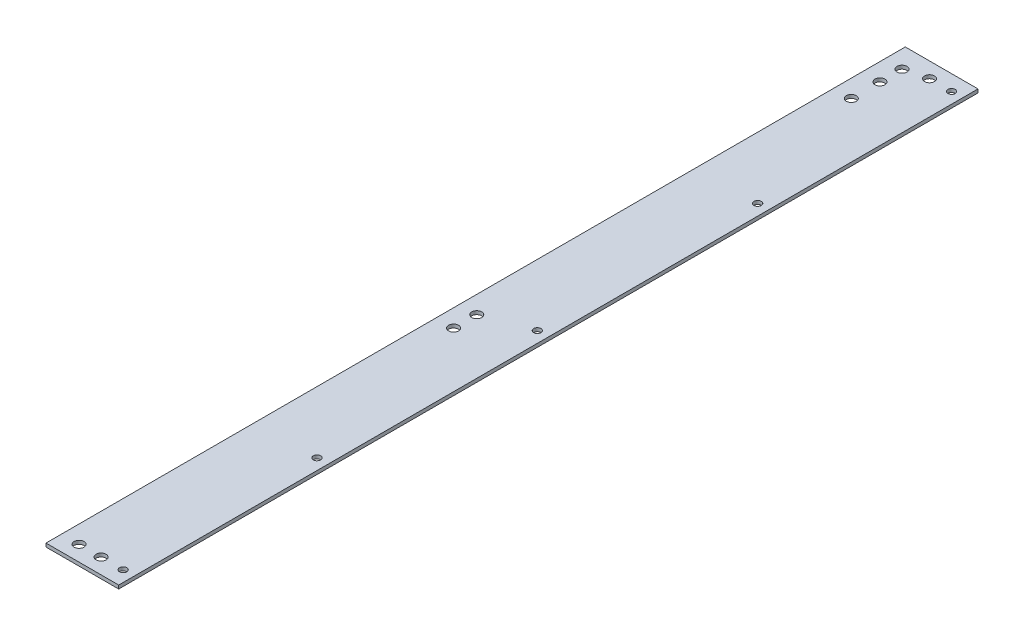
ISO-10303-21;
HEADER;
FILE_DESCRIPTION(('STEP AP214'),'2;1');
FILE_NAME('part.step','',(''),(''),'','','');
FILE_SCHEMA(('AUTOMOTIVE_DESIGN { 1 0 10303 214 1 1 1 1 }'));
ENDSEC;
DATA;
#1=APPLICATION_CONTEXT('core data for automotive mechanical design processes');
#2=APPLICATION_PROTOCOL_DEFINITION('international standard','automotive_design',2000,#1);
#3=PRODUCT_CONTEXT('',#1,'mechanical');
#4=PRODUCT('Part','Part','',(#3));
#5=PRODUCT_RELATED_PRODUCT_CATEGORY('part','',(#4));
#6=PRODUCT_DEFINITION_FORMATION('','',#4);
#7=PRODUCT_DEFINITION_CONTEXT('part definition',#1,'design');
#8=PRODUCT_DEFINITION('design','',#6,#7);
#9=PRODUCT_DEFINITION_SHAPE('','',#8);
#10=(LENGTH_UNIT() NAMED_UNIT(*) SI_UNIT(.MILLI.,.METRE.));
#11=(NAMED_UNIT(*) PLANE_ANGLE_UNIT() SI_UNIT($,.RADIAN.));
#12=(NAMED_UNIT(*) SI_UNIT($,.STERADIAN.) SOLID_ANGLE_UNIT());
#13=UNCERTAINTY_MEASURE_WITH_UNIT(LENGTH_MEASURE(1.E-05),#10,'distance_accuracy_value','');
#14=(GEOMETRIC_REPRESENTATION_CONTEXT(3) GLOBAL_UNCERTAINTY_ASSIGNED_CONTEXT((#13)) GLOBAL_UNIT_ASSIGNED_CONTEXT((#10,
#11,#12)) REPRESENTATION_CONTEXT('',''));
#15=CARTESIAN_POINT('',(0.,0.,0.));
#16=DIRECTION('',(0.,0.,1.));
#17=DIRECTION('',(1.,0.,0.));
#18=AXIS2_PLACEMENT_3D('',#15,#16,#17);
#19=CARTESIAN_POINT('',(0.,1.5875,0.));
#20=DIRECTION('',(0.,-1.,0.));
#21=DIRECTION('',(0.,0.,-1.));
#22=AXIS2_PLACEMENT_3D('',#19,#20,#21);
#23=PLANE('',#22);
#24=CARTESIAN_POINT('',(11.5,1.5875,-188.));
#25=DIRECTION('',(0.,1.,0.));
#26=DIRECTION('',(0.,0.,1.));
#27=AXIS2_PLACEMENT_3D('',#24,#25,#26);
#28=CIRCLE('',#27,1.65);
#29=CARTESIAN_POINT('',(11.5,1.5875,-186.35));
#30=VERTEX_POINT('',#29);
#31=EDGE_CURVE('E195',#30,#30,#28,.T.);
#32=ORIENTED_EDGE('',*,*,#31,.F.);
#33=EDGE_LOOP('',(#32));
#34=FACE_BOUND('',#33,.T.);
#35=CARTESIAN_POINT('',(11.5,1.5875,188.));
#36=DIRECTION('',(0.,1.,0.));
#37=DIRECTION('',(0.,0.,1.));
#38=AXIS2_PLACEMENT_3D('',#35,#36,#37);
#39=CIRCLE('',#38,1.65);
#40=CARTESIAN_POINT('',(11.5,1.5875,189.65));
#41=VERTEX_POINT('',#40);
#42=EDGE_CURVE('E189',#41,#41,#39,.T.);
#43=ORIENTED_EDGE('',*,*,#42,.F.);
#44=EDGE_LOOP('',(#43));
#45=FACE_BOUND('',#44,.T.);
#46=CARTESIAN_POINT('',(11.5,1.5875,-100.));
#47=DIRECTION('',(0.,1.,0.));
#48=DIRECTION('',(0.,0.,1.));
#49=AXIS2_PLACEMENT_3D('',#46,#47,#48);
#50=CIRCLE('',#49,1.65);
#51=CARTESIAN_POINT('',(11.5,1.5875,-98.35));
#52=VERTEX_POINT('',#51);
#53=EDGE_CURVE('E183',#52,#52,#50,.T.);
#54=ORIENTED_EDGE('',*,*,#53,.F.);
#55=EDGE_LOOP('',(#54));
#56=FACE_BOUND('',#55,.T.);
#57=CARTESIAN_POINT('',(11.5,1.5875,100.));
#58=DIRECTION('',(0.,1.,0.));
#59=DIRECTION('',(0.,0.,1.));
#60=AXIS2_PLACEMENT_3D('',#57,#58,#59);
#61=CIRCLE('',#60,1.65);
#62=CARTESIAN_POINT('',(11.5,1.5875,101.65));
#63=VERTEX_POINT('',#62);
#64=EDGE_CURVE('E177',#63,#63,#61,.T.);
#65=ORIENTED_EDGE('',*,*,#64,.F.);
#66=EDGE_LOOP('',(#65));
#67=FACE_BOUND('',#66,.T.);
#68=CARTESIAN_POINT('',(1.50000000000001,1.5875,-188.));
#69=DIRECTION('',(0.,1.,0.));
#70=DIRECTION('',(0.,0.,1.));
#71=AXIS2_PLACEMENT_3D('',#68,#69,#70);
#72=CIRCLE('',#71,2.24999999999999);
#73=CARTESIAN_POINT('',(1.50000000000001,1.5875,-185.75));
#74=VERTEX_POINT('',#73);
#75=EDGE_CURVE('E165',#74,#74,#72,.T.);
#76=ORIENTED_EDGE('',*,*,#75,.F.);
#77=EDGE_LOOP('',(#76));
#78=FACE_BOUND('',#77,.T.);
#79=CARTESIAN_POINT('',(-8.49999999999999,1.5875,-185.5));
#80=DIRECTION('',(0.,1.,0.));
#81=DIRECTION('',(0.,0.,1.));
#82=AXIS2_PLACEMENT_3D('',#79,#80,#81);
#83=CIRCLE('',#82,2.24999999999999);
#84=CARTESIAN_POINT('',(-8.49999999999999,1.5875,-183.25));
#85=VERTEX_POINT('',#84);
#86=EDGE_CURVE('E159',#85,#85,#83,.T.);
#87=ORIENTED_EDGE('',*,*,#86,.F.);
#88=EDGE_LOOP('',(#87));
#89=FACE_BOUND('',#88,.T.);
#90=CARTESIAN_POINT('',(-8.49999999999999,1.5875,-175.5));
#91=DIRECTION('',(0.,1.,0.));
#92=DIRECTION('',(0.,0.,1.));
#93=AXIS2_PLACEMENT_3D('',#90,#91,#92);
#94=CIRCLE('',#93,2.24999999999999);
#95=CARTESIAN_POINT('',(-8.49999999999999,1.5875,-173.25));
#96=VERTEX_POINT('',#95);
#97=EDGE_CURVE('E153',#96,#96,#94,.T.);
#98=ORIENTED_EDGE('',*,*,#97,.F.);
#99=EDGE_LOOP('',(#98));
#100=FACE_BOUND('',#99,.T.);
#101=CARTESIAN_POINT('',(-8.49999999999999,1.5875,-162.5));
#102=DIRECTION('',(0.,1.,0.));
#103=DIRECTION('',(0.,0.,1.));
#104=AXIS2_PLACEMENT_3D('',#101,#102,#103);
#105=CIRCLE('',#104,2.24999999999999);
#106=CARTESIAN_POINT('',(-8.49999999999999,1.5875,-160.25));
#107=VERTEX_POINT('',#106);
#108=EDGE_CURVE('E147',#107,#107,#105,.T.);
#109=ORIENTED_EDGE('',*,*,#108,.F.);
#110=EDGE_LOOP('',(#109));
#111=FACE_BOUND('',#110,.T.);
#112=CARTESIAN_POINT('',(-8.49999999999997,1.5875,18.));
#113=DIRECTION('',(0.,1.,0.));
#114=DIRECTION('',(0.,0.,1.));
#115=AXIS2_PLACEMENT_3D('',#112,#113,#114);
#116=CIRCLE('',#115,2.24999999999999);
#117=CARTESIAN_POINT('',(-8.49999999999997,1.5875,20.25));
#118=VERTEX_POINT('',#117);
#119=EDGE_CURVE('E135',#118,#118,#116,.T.);
#120=ORIENTED_EDGE('',*,*,#119,.F.);
#121=EDGE_LOOP('',(#120));
#122=FACE_BOUND('',#121,.T.);
#123=CARTESIAN_POINT('',(-8.49999999999994,1.5875,188.));
#124=DIRECTION('',(0.,1.,0.));
#125=DIRECTION('',(0.,0.,1.));
#126=AXIS2_PLACEMENT_3D('',#123,#124,#125);
#127=CIRCLE('',#126,2.24999999999999);
#128=CARTESIAN_POINT('',(-8.49999999999994,1.5875,190.25));
#129=VERTEX_POINT('',#128);
#130=EDGE_CURVE('E129',#129,#129,#127,.T.);
#131=ORIENTED_EDGE('',*,*,#130,.F.);
#132=EDGE_LOOP('',(#131));
#133=FACE_BOUND('',#132,.T.);
#134=CARTESIAN_POINT('',(1.50000000000001,1.5875,188.));
#135=DIRECTION('',(0.,1.,0.));
#136=DIRECTION('',(0.,0.,1.));
#137=AXIS2_PLACEMENT_3D('',#134,#135,#136);
#138=CIRCLE('',#137,2.24999999999999);
#139=CARTESIAN_POINT('',(1.50000000000001,1.5875,190.25));
#140=VERTEX_POINT('',#139);
#141=EDGE_CURVE('E123',#140,#140,#138,.T.);
#142=ORIENTED_EDGE('',*,*,#141,.F.);
#143=EDGE_LOOP('',(#142));
#144=FACE_BOUND('',#143,.T.);
#145=DIRECTION('',(0.,0.,-1.));
#146=VECTOR('',#145,1.);
#147=CARTESIAN_POINT('',(16.5,1.5875,195.));
#148=LINE('',#147,#146);
#149=CARTESIAN_POINT('',(16.5,1.5875,195.));
#150=VERTEX_POINT('',#149);
#151=CARTESIAN_POINT('',(16.5,1.5875,-195.));
#152=VERTEX_POINT('',#151);
#153=EDGE_CURVE('E94',#150,#152,#148,.T.);
#154=ORIENTED_EDGE('',*,*,#153,.T.);
#155=DIRECTION('',(-1.,0.,0.));
#156=VECTOR('',#155,1.);
#157=CARTESIAN_POINT('',(-16.5,1.5875,-195.));
#158=LINE('',#157,#156);
#159=CARTESIAN_POINT('',(-16.5,1.5875,-195.));
#160=VERTEX_POINT('',#159);
#161=EDGE_CURVE('E89',#152,#160,#158,.T.);
#162=ORIENTED_EDGE('',*,*,#161,.T.);
#163=DIRECTION('',(0.,0.,1.));
#164=VECTOR('',#163,1.);
#165=CARTESIAN_POINT('',(-16.5,1.5875,195.));
#166=LINE('',#165,#164);
#167=CARTESIAN_POINT('',(-16.5,1.5875,195.));
#168=VERTEX_POINT('',#167);
#169=EDGE_CURVE('E92',#160,#168,#166,.T.);
#170=ORIENTED_EDGE('',*,*,#169,.T.);
#171=DIRECTION('',(1.,0.,0.));
#172=VECTOR('',#171,1.);
#173=CARTESIAN_POINT('',(-16.5,1.5875,195.));
#174=LINE('',#173,#172);
#175=EDGE_CURVE('E59',#168,#150,#174,.T.);
#176=ORIENTED_EDGE('',*,*,#175,.T.);
#177=EDGE_LOOP('',(#154,#162,#170,#176));
#178=FACE_BOUND('',#177,.T.);
#179=CARTESIAN_POINT('',(-8.49999999999997,1.5875,7.49999999999998));
#180=DIRECTION('',(0.,1.,0.));
#181=DIRECTION('',(0.,0.,1.));
#182=AXIS2_PLACEMENT_3D('',#179,#180,#181);
#183=CIRCLE('',#182,2.24999999999999);
#184=CARTESIAN_POINT('',(-8.49999999999997,1.5875,9.74999999999997));
#185=VERTEX_POINT('',#184);
#186=EDGE_CURVE('E141',#185,#185,#183,.T.);
#187=ORIENTED_EDGE('',*,*,#186,.F.);
#188=EDGE_LOOP('',(#187));
#189=FACE_BOUND('',#188,.T.);
#190=CARTESIAN_POINT('',(11.5,1.5875,0.));
#191=DIRECTION('',(0.,1.,0.));
#192=DIRECTION('',(0.,0.,1.));
#193=AXIS2_PLACEMENT_3D('',#190,#191,#192);
#194=CIRCLE('',#193,1.65);
#195=CARTESIAN_POINT('',(11.5,1.5875,1.65));
#196=VERTEX_POINT('',#195);
#197=EDGE_CURVE('E171',#196,#196,#194,.T.);
#198=ORIENTED_EDGE('',*,*,#197,.F.);
#199=EDGE_LOOP('',(#198));
#200=FACE_BOUND('',#199,.T.);
#201=ADVANCED_FACE('F42',(#34,#45,#56,#67,#78,#89,#100,#111,#122,#133,#144,#178,#189,#200),#23,.F.);
#202=CARTESIAN_POINT('',(0.,0.,0.));
#203=DIRECTION('',(0.,-1.,0.));
#204=DIRECTION('',(0.,0.,-1.));
#205=AXIS2_PLACEMENT_3D('',#202,#203,#204);
#206=PLANE('',#205);
#207=CARTESIAN_POINT('',(11.5,0.,-188.));
#208=DIRECTION('',(0.,1.,0.));
#209=DIRECTION('',(0.,0.,1.));
#210=AXIS2_PLACEMENT_3D('',#207,#208,#209);
#211=CIRCLE('',#210,1.65);
#212=CARTESIAN_POINT('',(11.5,0.,-186.35));
#213=VERTEX_POINT('',#212);
#214=EDGE_CURVE('E192',#213,#213,#211,.T.);
#215=ORIENTED_EDGE('',*,*,#214,.T.);
#216=EDGE_LOOP('',(#215));
#217=FACE_BOUND('',#216,.T.);
#218=CARTESIAN_POINT('',(11.5,0.,188.));
#219=DIRECTION('',(0.,1.,0.));
#220=DIRECTION('',(0.,0.,1.));
#221=AXIS2_PLACEMENT_3D('',#218,#219,#220);
#222=CIRCLE('',#221,1.65);
#223=CARTESIAN_POINT('',(11.5,0.,189.65));
#224=VERTEX_POINT('',#223);
#225=EDGE_CURVE('E186',#224,#224,#222,.T.);
#226=ORIENTED_EDGE('',*,*,#225,.T.);
#227=EDGE_LOOP('',(#226));
#228=FACE_BOUND('',#227,.T.);
#229=CARTESIAN_POINT('',(11.5,0.,-100.));
#230=DIRECTION('',(0.,1.,0.));
#231=DIRECTION('',(0.,0.,1.));
#232=AXIS2_PLACEMENT_3D('',#229,#230,#231);
#233=CIRCLE('',#232,1.65);
#234=CARTESIAN_POINT('',(11.5,0.,-98.35));
#235=VERTEX_POINT('',#234);
#236=EDGE_CURVE('E180',#235,#235,#233,.T.);
#237=ORIENTED_EDGE('',*,*,#236,.T.);
#238=EDGE_LOOP('',(#237));
#239=FACE_BOUND('',#238,.T.);
#240=CARTESIAN_POINT('',(11.5,0.,100.));
#241=DIRECTION('',(0.,1.,0.));
#242=DIRECTION('',(0.,0.,1.));
#243=AXIS2_PLACEMENT_3D('',#240,#241,#242);
#244=CIRCLE('',#243,1.65);
#245=CARTESIAN_POINT('',(11.5,0.,101.65));
#246=VERTEX_POINT('',#245);
#247=EDGE_CURVE('E174',#246,#246,#244,.T.);
#248=ORIENTED_EDGE('',*,*,#247,.T.);
#249=EDGE_LOOP('',(#248));
#250=FACE_BOUND('',#249,.T.);
#251=CARTESIAN_POINT('',(11.5,0.,0.));
#252=DIRECTION('',(0.,1.,0.));
#253=DIRECTION('',(0.,0.,1.));
#254=AXIS2_PLACEMENT_3D('',#251,#252,#253);
#255=CIRCLE('',#254,1.65);
#256=CARTESIAN_POINT('',(11.5,0.,1.65));
#257=VERTEX_POINT('',#256);
#258=EDGE_CURVE('E168',#257,#257,#255,.T.);
#259=ORIENTED_EDGE('',*,*,#258,.T.);
#260=EDGE_LOOP('',(#259));
#261=FACE_BOUND('',#260,.T.);
#262=CARTESIAN_POINT('',(1.50000000000001,0.,-188.));
#263=DIRECTION('',(0.,1.,0.));
#264=DIRECTION('',(0.,0.,1.));
#265=AXIS2_PLACEMENT_3D('',#262,#263,#264);
#266=CIRCLE('',#265,2.25);
#267=CARTESIAN_POINT('',(1.50000000000001,0.,-185.75));
#268=VERTEX_POINT('',#267);
#269=EDGE_CURVE('E162',#268,#268,#266,.T.);
#270=ORIENTED_EDGE('',*,*,#269,.T.);
#271=EDGE_LOOP('',(#270));
#272=FACE_BOUND('',#271,.T.);
#273=CARTESIAN_POINT('',(-8.49999999999999,0.,-185.5));
#274=DIRECTION('',(0.,1.,0.));
#275=DIRECTION('',(0.,0.,1.));
#276=AXIS2_PLACEMENT_3D('',#273,#274,#275);
#277=CIRCLE('',#276,2.25);
#278=CARTESIAN_POINT('',(-8.49999999999999,0.,-183.25));
#279=VERTEX_POINT('',#278);
#280=EDGE_CURVE('E156',#279,#279,#277,.T.);
#281=ORIENTED_EDGE('',*,*,#280,.T.);
#282=EDGE_LOOP('',(#281));
#283=FACE_BOUND('',#282,.T.);
#284=CARTESIAN_POINT('',(-8.49999999999999,0.,-175.5));
#285=DIRECTION('',(0.,1.,0.));
#286=DIRECTION('',(0.,0.,1.));
#287=AXIS2_PLACEMENT_3D('',#284,#285,#286);
#288=CIRCLE('',#287,2.25);
#289=CARTESIAN_POINT('',(-8.49999999999999,0.,-173.25));
#290=VERTEX_POINT('',#289);
#291=EDGE_CURVE('E150',#290,#290,#288,.T.);
#292=ORIENTED_EDGE('',*,*,#291,.T.);
#293=EDGE_LOOP('',(#292));
#294=FACE_BOUND('',#293,.T.);
#295=CARTESIAN_POINT('',(-8.49999999999999,0.,-162.5));
#296=DIRECTION('',(0.,1.,0.));
#297=DIRECTION('',(0.,0.,1.));
#298=AXIS2_PLACEMENT_3D('',#295,#296,#297);
#299=CIRCLE('',#298,2.25);
#300=CARTESIAN_POINT('',(-8.49999999999999,0.,-160.25));
#301=VERTEX_POINT('',#300);
#302=EDGE_CURVE('E144',#301,#301,#299,.T.);
#303=ORIENTED_EDGE('',*,*,#302,.T.);
#304=EDGE_LOOP('',(#303));
#305=FACE_BOUND('',#304,.T.);
#306=CARTESIAN_POINT('',(-8.49999999999997,0.,7.49999999999998));
#307=DIRECTION('',(0.,1.,0.));
#308=DIRECTION('',(0.,0.,1.));
#309=AXIS2_PLACEMENT_3D('',#306,#307,#308);
#310=CIRCLE('',#309,2.25);
#311=CARTESIAN_POINT('',(-8.49999999999997,0.,9.74999999999998));
#312=VERTEX_POINT('',#311);
#313=EDGE_CURVE('E138',#312,#312,#310,.T.);
#314=ORIENTED_EDGE('',*,*,#313,.T.);
#315=EDGE_LOOP('',(#314));
#316=FACE_BOUND('',#315,.T.);
#317=DIRECTION('',(0.,0.,-1.));
#318=VECTOR('',#317,1.);
#319=CARTESIAN_POINT('',(16.5,0.,195.));
#320=LINE('',#319,#318);
#321=CARTESIAN_POINT('',(16.5,0.,195.));
#322=VERTEX_POINT('',#321);
#323=CARTESIAN_POINT('',(16.5,0.,-195.));
#324=VERTEX_POINT('',#323);
#325=EDGE_CURVE('E106',#322,#324,#320,.T.);
#326=ORIENTED_EDGE('',*,*,#325,.F.);
#327=DIRECTION('',(1.,0.,0.));
#328=VECTOR('',#327,1.);
#329=CARTESIAN_POINT('',(-16.5,0.,195.));
#330=LINE('',#329,#328);
#331=CARTESIAN_POINT('',(-16.5,0.,195.));
#332=VERTEX_POINT('',#331);
#333=EDGE_CURVE('E82',#332,#322,#330,.T.);
#334=ORIENTED_EDGE('',*,*,#333,.F.);
#335=DIRECTION('',(0.,0.,1.));
#336=VECTOR('',#335,1.);
#337=CARTESIAN_POINT('',(-16.5,0.,195.));
#338=LINE('',#337,#336);
#339=CARTESIAN_POINT('',(-16.5,0.,-195.));
#340=VERTEX_POINT('',#339);
#341=EDGE_CURVE('E76',#340,#332,#338,.T.);
#342=ORIENTED_EDGE('',*,*,#341,.F.);
#343=DIRECTION('',(-1.,0.,0.));
#344=VECTOR('',#343,1.);
#345=CARTESIAN_POINT('',(-16.5,0.,-195.));
#346=LINE('',#345,#344);
#347=EDGE_CURVE('E98',#324,#340,#346,.T.);
#348=ORIENTED_EDGE('',*,*,#347,.F.);
#349=EDGE_LOOP('',(#326,#334,#342,#348));
#350=FACE_BOUND('',#349,.T.);
#351=CARTESIAN_POINT('',(1.50000000000001,0.,188.));
#352=DIRECTION('',(0.,1.,0.));
#353=DIRECTION('',(0.,0.,1.));
#354=AXIS2_PLACEMENT_3D('',#351,#352,#353);
#355=CIRCLE('',#354,2.25);
#356=CARTESIAN_POINT('',(1.50000000000001,0.,190.25));
#357=VERTEX_POINT('',#356);
#358=EDGE_CURVE('E109',#357,#357,#355,.T.);
#359=ORIENTED_EDGE('',*,*,#358,.T.);
#360=EDGE_LOOP('',(#359));
#361=FACE_BOUND('',#360,.T.);
#362=CARTESIAN_POINT('',(-8.49999999999994,0.,188.));
#363=DIRECTION('',(0.,1.,0.));
#364=DIRECTION('',(0.,0.,1.));
#365=AXIS2_PLACEMENT_3D('',#362,#363,#364);
#366=CIRCLE('',#365,2.25);
#367=CARTESIAN_POINT('',(-8.49999999999994,0.,190.25));
#368=VERTEX_POINT('',#367);
#369=EDGE_CURVE('E126',#368,#368,#366,.T.);
#370=ORIENTED_EDGE('',*,*,#369,.T.);
#371=EDGE_LOOP('',(#370));
#372=FACE_BOUND('',#371,.T.);
#373=CARTESIAN_POINT('',(-8.49999999999997,0.,18.));
#374=DIRECTION('',(0.,1.,0.));
#375=DIRECTION('',(0.,0.,1.));
#376=AXIS2_PLACEMENT_3D('',#373,#374,#375);
#377=CIRCLE('',#376,2.25);
#378=CARTESIAN_POINT('',(-8.49999999999997,0.,20.25));
#379=VERTEX_POINT('',#378);
#380=EDGE_CURVE('E132',#379,#379,#377,.T.);
#381=ORIENTED_EDGE('',*,*,#380,.T.);
#382=EDGE_LOOP('',(#381));
#383=FACE_BOUND('',#382,.T.);
#384=ADVANCED_FACE('F117',(#217,#228,#239,#250,#261,#272,#283,#294,#305,#316,#350,#361,#372,
#383),#206,.T.);
#385=CARTESIAN_POINT('',(16.5,1.5875,195.));
#386=DIRECTION('',(-1.,0.,0.));
#387=DIRECTION('',(0.,0.,1.));
#388=AXIS2_PLACEMENT_3D('',#385,#386,#387);
#389=PLANE('',#388);
#390=ORIENTED_EDGE('',*,*,#325,.T.);
#391=DIRECTION('',(0.,-1.,0.));
#392=VECTOR('',#391,1.);
#393=CARTESIAN_POINT('',(16.5,1.5875,-195.));
#394=LINE('',#393,#392);
#395=EDGE_CURVE('E11',#152,#324,#394,.T.);
#396=ORIENTED_EDGE('',*,*,#395,.F.);
#397=ORIENTED_EDGE('',*,*,#153,.F.);
#398=DIRECTION('',(0.,-1.,0.));
#399=VECTOR('',#398,1.);
#400=CARTESIAN_POINT('',(16.5,1.5875,195.));
#401=LINE('',#400,#399);
#402=EDGE_CURVE('E102',#150,#322,#401,.T.);
#403=ORIENTED_EDGE('',*,*,#402,.T.);
#404=EDGE_LOOP('',(#390,#396,#397,#403));
#405=FACE_BOUND('',#404,.T.);
#406=ADVANCED_FACE('F44',(#405),#389,.F.);
#407=CARTESIAN_POINT('',(-16.5,1.5875,-195.));
#408=DIRECTION('',(0.,0.,1.));
#409=DIRECTION('',(1.,0.,0.));
#410=AXIS2_PLACEMENT_3D('',#407,#408,#409);
#411=PLANE('',#410);
#412=ORIENTED_EDGE('',*,*,#347,.T.);
#413=DIRECTION('',(0.,-1.,0.));
#414=VECTOR('',#413,1.);
#415=CARTESIAN_POINT('',(-16.5,1.5875,-195.));
#416=LINE('',#415,#414);
#417=EDGE_CURVE('E51',#160,#340,#416,.T.);
#418=ORIENTED_EDGE('',*,*,#417,.F.);
#419=ORIENTED_EDGE('',*,*,#161,.F.);
#420=ORIENTED_EDGE('',*,*,#395,.T.);
#421=EDGE_LOOP('',(#412,#418,#419,#420));
#422=FACE_BOUND('',#421,.T.);
#423=ADVANCED_FACE('F97',(#422),#411,.F.);
#424=CARTESIAN_POINT('',(-16.5,1.5875,195.));
#425=DIRECTION('',(1.,0.,0.));
#426=DIRECTION('',(0.,0.,-1.));
#427=AXIS2_PLACEMENT_3D('',#424,#425,#426);
#428=PLANE('',#427);
#429=ORIENTED_EDGE('',*,*,#341,.T.);
#430=DIRECTION('',(0.,-1.,0.));
#431=VECTOR('',#430,1.);
#432=CARTESIAN_POINT('',(-16.5,1.5875,195.));
#433=LINE('',#432,#431);
#434=EDGE_CURVE('E99',#168,#332,#433,.T.);
#435=ORIENTED_EDGE('',*,*,#434,.F.);
#436=ORIENTED_EDGE('',*,*,#169,.F.);
#437=ORIENTED_EDGE('',*,*,#417,.T.);
#438=EDGE_LOOP('',(#429,#435,#436,#437));
#439=FACE_BOUND('',#438,.T.);
#440=ADVANCED_FACE('F100',(#439),#428,.F.);
#441=CARTESIAN_POINT('',(-16.5,1.5875,195.));
#442=DIRECTION('',(0.,0.,-1.));
#443=DIRECTION('',(-1.,0.,0.));
#444=AXIS2_PLACEMENT_3D('',#441,#442,#443);
#445=PLANE('',#444);
#446=ORIENTED_EDGE('',*,*,#333,.T.);
#447=ORIENTED_EDGE('',*,*,#402,.F.);
#448=ORIENTED_EDGE('',*,*,#175,.F.);
#449=ORIENTED_EDGE('',*,*,#434,.T.);
#450=EDGE_LOOP('',(#446,#447,#448,#449));
#451=FACE_BOUND('',#450,.T.);
#452=ADVANCED_FACE('F114',(#451),#445,.F.);
#453=CARTESIAN_POINT('',(1.50000000000001,1.5875,188.));
#454=DIRECTION('',(0.,1.,0.));
#455=DIRECTION('',(0.,0.,1.));
#456=AXIS2_PLACEMENT_3D('',#453,#454,#455);
#457=CYLINDRICAL_SURFACE('',#456,2.24999999999999);
#458=ORIENTED_EDGE('',*,*,#358,.F.);
#459=EDGE_LOOP('',(#458));
#460=FACE_BOUND('',#459,.T.);
#461=ORIENTED_EDGE('',*,*,#141,.T.);
#462=EDGE_LOOP('',(#461));
#463=FACE_BOUND('',#462,.T.);
#464=ADVANCED_FACE('F224',(#460,#463),#457,.F.);
#465=CARTESIAN_POINT('',(-8.49999999999994,1.5875,188.));
#466=DIRECTION('',(0.,1.,0.));
#467=DIRECTION('',(0.,0.,1.));
#468=AXIS2_PLACEMENT_3D('',#465,#466,#467);
#469=CYLINDRICAL_SURFACE('',#468,2.24999999999999);
#470=ORIENTED_EDGE('',*,*,#369,.F.);
#471=EDGE_LOOP('',(#470));
#472=FACE_BOUND('',#471,.T.);
#473=ORIENTED_EDGE('',*,*,#130,.T.);
#474=EDGE_LOOP('',(#473));
#475=FACE_BOUND('',#474,.T.);
#476=ADVANCED_FACE('F226',(#472,#475),#469,.F.);
#477=CARTESIAN_POINT('',(-8.49999999999997,1.5875,18.));
#478=DIRECTION('',(0.,1.,0.));
#479=DIRECTION('',(0.,0.,1.));
#480=AXIS2_PLACEMENT_3D('',#477,#478,#479);
#481=CYLINDRICAL_SURFACE('',#480,2.24999999999999);
#482=ORIENTED_EDGE('',*,*,#380,.F.);
#483=EDGE_LOOP('',(#482));
#484=FACE_BOUND('',#483,.T.);
#485=ORIENTED_EDGE('',*,*,#119,.T.);
#486=EDGE_LOOP('',(#485));
#487=FACE_BOUND('',#486,.T.);
#488=ADVANCED_FACE('F233',(#484,#487),#481,.F.);
#489=CARTESIAN_POINT('',(-8.49999999999997,1.5875,7.49999999999998));
#490=DIRECTION('',(0.,1.,0.));
#491=DIRECTION('',(0.,0.,1.));
#492=AXIS2_PLACEMENT_3D('',#489,#490,#491);
#493=CYLINDRICAL_SURFACE('',#492,2.24999999999999);
#494=ORIENTED_EDGE('',*,*,#313,.F.);
#495=EDGE_LOOP('',(#494));
#496=FACE_BOUND('',#495,.T.);
#497=ORIENTED_EDGE('',*,*,#186,.T.);
#498=EDGE_LOOP('',(#497));
#499=FACE_BOUND('',#498,.T.);
#500=ADVANCED_FACE('F287',(#496,#499),#493,.F.);
#501=CARTESIAN_POINT('',(-8.49999999999999,1.5875,-162.5));
#502=DIRECTION('',(0.,1.,0.));
#503=DIRECTION('',(0.,0.,1.));
#504=AXIS2_PLACEMENT_3D('',#501,#502,#503);
#505=CYLINDRICAL_SURFACE('',#504,2.24999999999999);
#506=ORIENTED_EDGE('',*,*,#302,.F.);
#507=EDGE_LOOP('',(#506));
#508=FACE_BOUND('',#507,.T.);
#509=ORIENTED_EDGE('',*,*,#108,.T.);
#510=EDGE_LOOP('',(#509));
#511=FACE_BOUND('',#510,.T.);
#512=ADVANCED_FACE('F296',(#508,#511),#505,.F.);
#513=CARTESIAN_POINT('',(-8.49999999999999,1.5875,-175.5));
#514=DIRECTION('',(0.,1.,0.));
#515=DIRECTION('',(0.,0.,1.));
#516=AXIS2_PLACEMENT_3D('',#513,#514,#515);
#517=CYLINDRICAL_SURFACE('',#516,2.24999999999999);
#518=ORIENTED_EDGE('',*,*,#291,.F.);
#519=EDGE_LOOP('',(#518));
#520=FACE_BOUND('',#519,.T.);
#521=ORIENTED_EDGE('',*,*,#97,.T.);
#522=EDGE_LOOP('',(#521));
#523=FACE_BOUND('',#522,.T.);
#524=ADVANCED_FACE('F306',(#520,#523),#517,.F.);
#525=CARTESIAN_POINT('',(-8.49999999999999,1.5875,-185.5));
#526=DIRECTION('',(0.,1.,0.));
#527=DIRECTION('',(0.,0.,1.));
#528=AXIS2_PLACEMENT_3D('',#525,#526,#527);
#529=CYLINDRICAL_SURFACE('',#528,2.24999999999999);
#530=ORIENTED_EDGE('',*,*,#280,.F.);
#531=EDGE_LOOP('',(#530));
#532=FACE_BOUND('',#531,.T.);
#533=ORIENTED_EDGE('',*,*,#86,.T.);
#534=EDGE_LOOP('',(#533));
#535=FACE_BOUND('',#534,.T.);
#536=ADVANCED_FACE('F316',(#532,#535),#529,.F.);
#537=CARTESIAN_POINT('',(1.50000000000001,1.5875,-188.));
#538=DIRECTION('',(0.,1.,0.));
#539=DIRECTION('',(0.,0.,1.));
#540=AXIS2_PLACEMENT_3D('',#537,#538,#539);
#541=CYLINDRICAL_SURFACE('',#540,2.24999999999999);
#542=ORIENTED_EDGE('',*,*,#269,.F.);
#543=EDGE_LOOP('',(#542));
#544=FACE_BOUND('',#543,.T.);
#545=ORIENTED_EDGE('',*,*,#75,.T.);
#546=EDGE_LOOP('',(#545));
#547=FACE_BOUND('',#546,.T.);
#548=ADVANCED_FACE('F326',(#544,#547),#541,.F.);
#549=CARTESIAN_POINT('',(11.5,1.5875,0.));
#550=DIRECTION('',(0.,1.,0.));
#551=DIRECTION('',(0.,0.,1.));
#552=AXIS2_PLACEMENT_3D('',#549,#550,#551);
#553=CYLINDRICAL_SURFACE('',#552,1.65);
#554=ORIENTED_EDGE('',*,*,#258,.F.);
#555=EDGE_LOOP('',(#554));
#556=FACE_BOUND('',#555,.T.);
#557=ORIENTED_EDGE('',*,*,#197,.T.);
#558=EDGE_LOOP('',(#557));
#559=FACE_BOUND('',#558,.T.);
#560=ADVANCED_FACE('F336',(#556,#559),#553,.F.);
#561=CARTESIAN_POINT('',(11.5,1.5875,100.));
#562=DIRECTION('',(0.,1.,0.));
#563=DIRECTION('',(0.,0.,1.));
#564=AXIS2_PLACEMENT_3D('',#561,#562,#563);
#565=CYLINDRICAL_SURFACE('',#564,1.65);
#566=ORIENTED_EDGE('',*,*,#247,.F.);
#567=EDGE_LOOP('',(#566));
#568=FACE_BOUND('',#567,.T.);
#569=ORIENTED_EDGE('',*,*,#64,.T.);
#570=EDGE_LOOP('',(#569));
#571=FACE_BOUND('',#570,.T.);
#572=ADVANCED_FACE('F361',(#568,#571),#565,.F.);
#573=CARTESIAN_POINT('',(11.5,1.5875,-100.));
#574=DIRECTION('',(0.,1.,0.));
#575=DIRECTION('',(0.,0.,1.));
#576=AXIS2_PLACEMENT_3D('',#573,#574,#575);
#577=CYLINDRICAL_SURFACE('',#576,1.65);
#578=ORIENTED_EDGE('',*,*,#236,.F.);
#579=EDGE_LOOP('',(#578));
#580=FACE_BOUND('',#579,.T.);
#581=ORIENTED_EDGE('',*,*,#53,.T.);
#582=EDGE_LOOP('',(#581));
#583=FACE_BOUND('',#582,.T.);
#584=ADVANCED_FACE('F372',(#580,#583),#577,.F.);
#585=CARTESIAN_POINT('',(11.5,1.5875,188.));
#586=DIRECTION('',(0.,1.,0.));
#587=DIRECTION('',(0.,0.,1.));
#588=AXIS2_PLACEMENT_3D('',#585,#586,#587);
#589=CYLINDRICAL_SURFACE('',#588,1.65);
#590=ORIENTED_EDGE('',*,*,#225,.F.);
#591=EDGE_LOOP('',(#590));
#592=FACE_BOUND('',#591,.T.);
#593=ORIENTED_EDGE('',*,*,#42,.T.);
#594=EDGE_LOOP('',(#593));
#595=FACE_BOUND('',#594,.T.);
#596=ADVANCED_FACE('F383',(#592,#595),#589,.F.);
#597=CARTESIAN_POINT('',(11.5,1.5875,-188.));
#598=DIRECTION('',(0.,1.,0.));
#599=DIRECTION('',(0.,0.,1.));
#600=AXIS2_PLACEMENT_3D('',#597,#598,#599);
#601=CYLINDRICAL_SURFACE('',#600,1.65);
#602=ORIENTED_EDGE('',*,*,#214,.F.);
#603=EDGE_LOOP('',(#602));
#604=FACE_BOUND('',#603,.T.);
#605=ORIENTED_EDGE('',*,*,#31,.T.);
#606=EDGE_LOOP('',(#605));
#607=FACE_BOUND('',#606,.T.);
#608=ADVANCED_FACE('F199',(#604,#607),#601,.F.);
#609=CLOSED_SHELL('',(#201,#384,#406,#423,#440,#452,#464,#476,#488,#500,#512,#524,#536,#548,
#560,#572,#584,#596,#608));
#610=MANIFOLD_SOLID_BREP('B2',#609);
#611=ADVANCED_BREP_SHAPE_REPRESENTATION('',(#18,#610),#14);
#612=SHAPE_DEFINITION_REPRESENTATION(#9,#611);
ENDSEC;
END-ISO-10303-21;
